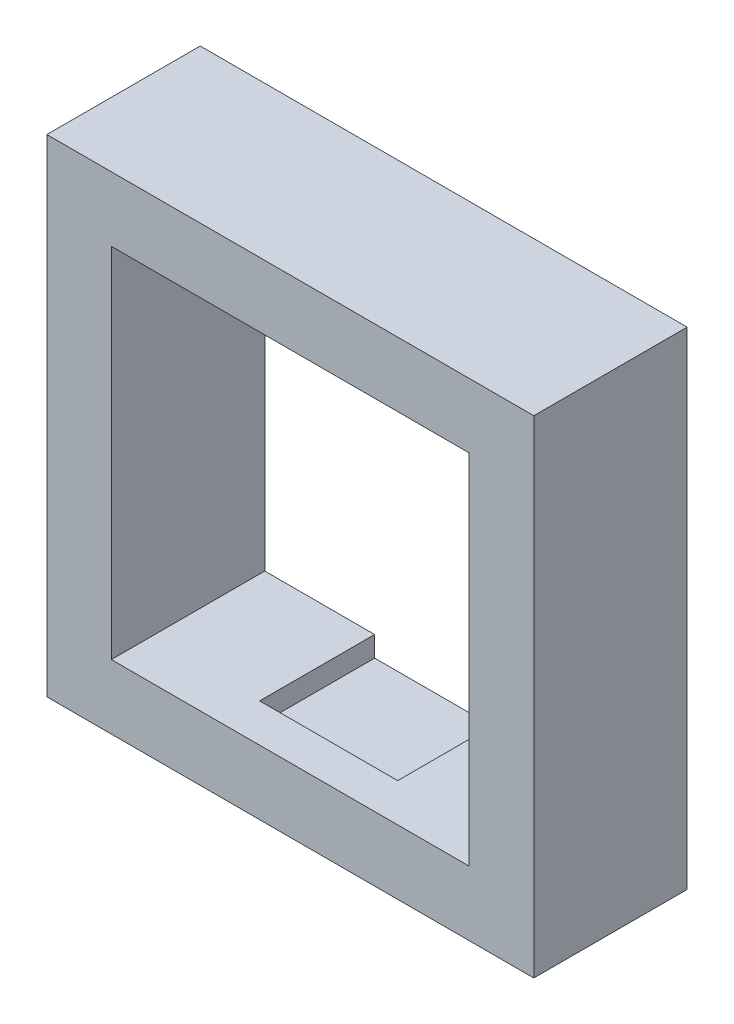
ISO-10303-21;
HEADER;
FILE_DESCRIPTION(('STEP AP214'),'2;1');
FILE_NAME('part.step','',(''),(''),'','','');
FILE_SCHEMA(('AUTOMOTIVE_DESIGN { 1 0 10303 214 1 1 1 1 }'));
ENDSEC;
DATA;
#1=APPLICATION_CONTEXT('core data for automotive mechanical design processes');
#2=APPLICATION_PROTOCOL_DEFINITION('international standard','automotive_design',2000,#1);
#3=PRODUCT_CONTEXT('',#1,'mechanical');
#4=PRODUCT('Part','Part','',(#3));
#5=PRODUCT_RELATED_PRODUCT_CATEGORY('part','',(#4));
#6=PRODUCT_DEFINITION_FORMATION('','',#4);
#7=PRODUCT_DEFINITION_CONTEXT('part definition',#1,'design');
#8=PRODUCT_DEFINITION('design','',#6,#7);
#9=PRODUCT_DEFINITION_SHAPE('','',#8);
#10=(LENGTH_UNIT() NAMED_UNIT(*) SI_UNIT(.MILLI.,.METRE.));
#11=(NAMED_UNIT(*) PLANE_ANGLE_UNIT() SI_UNIT($,.RADIAN.));
#12=(NAMED_UNIT(*) SI_UNIT($,.STERADIAN.) SOLID_ANGLE_UNIT());
#13=UNCERTAINTY_MEASURE_WITH_UNIT(LENGTH_MEASURE(1.E-05),#10,'distance_accuracy_value','');
#14=(GEOMETRIC_REPRESENTATION_CONTEXT(3) GLOBAL_UNCERTAINTY_ASSIGNED_CONTEXT((#13)) GLOBAL_UNIT_ASSIGNED_CONTEXT((#10,
#11,#12)) REPRESENTATION_CONTEXT('',''));
#15=CARTESIAN_POINT('',(0.,0.,0.));
#16=DIRECTION('',(0.,0.,1.));
#17=DIRECTION('',(1.,0.,0.));
#18=AXIS2_PLACEMENT_3D('',#15,#16,#17);
#19=CARTESIAN_POINT('',(0.,0.,0.));
#20=DIRECTION('',(0.,0.,-1.));
#21=DIRECTION('',(-1.,0.,0.));
#22=AXIS2_PLACEMENT_3D('',#19,#20,#21);
#23=PLANE('',#22);
#24=DIRECTION('',(0.,1.,0.));
#25=VECTOR('',#24,1.);
#26=CARTESIAN_POINT('',(9.525,-9.525,0.));
#27=LINE('',#26,#25);
#28=CARTESIAN_POINT('',(9.525,-9.525,0.));
#29=VERTEX_POINT('',#28);
#30=CARTESIAN_POINT('',(9.525,9.525,0.));
#31=VERTEX_POINT('',#30);
#32=EDGE_CURVE('E240',#29,#31,#27,.T.);
#33=ORIENTED_EDGE('',*,*,#32,.F.);
#34=DIRECTION('',(1.,0.,0.));
#35=VECTOR('',#34,1.);
#36=CARTESIAN_POINT('',(-9.525,-9.525,0.));
#37=LINE('',#36,#35);
#38=CARTESIAN_POINT('',(-9.525,-9.525,0.));
#39=VERTEX_POINT('',#38);
#40=EDGE_CURVE('E245',#39,#29,#37,.T.);
#41=ORIENTED_EDGE('',*,*,#40,.F.);
#42=DIRECTION('',(0.,-1.,0.));
#43=VECTOR('',#42,1.);
#44=CARTESIAN_POINT('',(-9.525,-9.525,0.));
#45=LINE('',#44,#43);
#46=CARTESIAN_POINT('',(-9.525,9.525,0.));
#47=VERTEX_POINT('',#46);
#48=EDGE_CURVE('E256',#47,#39,#45,.T.);
#49=ORIENTED_EDGE('',*,*,#48,.F.);
#50=DIRECTION('',(-1.,0.,0.));
#51=VECTOR('',#50,1.);
#52=CARTESIAN_POINT('',(-9.525,9.525,0.));
#53=LINE('',#52,#51);
#54=EDGE_CURVE('E254',#31,#47,#53,.T.);
#55=ORIENTED_EDGE('',*,*,#54,.F.);
#56=EDGE_LOOP('',(#33,#41,#49,#55));
#57=FACE_BOUND('',#56,.T.);
#58=DIRECTION('',(1.,0.,0.));
#59=VECTOR('',#58,1.);
#60=CARTESIAN_POINT('',(-7.,-7.,0.));
#61=LINE('',#60,#59);
#62=CARTESIAN_POINT('',(-7.,-7.,0.));
#63=VERTEX_POINT('',#62);
#64=CARTESIAN_POINT('',(-2.7,-7.,0.));
#65=VERTEX_POINT('',#64);
#66=EDGE_CURVE('E210',#63,#65,#61,.T.);
#67=ORIENTED_EDGE('',*,*,#66,.T.);
#68=DIRECTION('',(0.,1.,0.));
#69=VECTOR('',#68,1.);
#70=CARTESIAN_POINT('',(-2.7,-15.629224708316,0.));
#71=LINE('',#70,#69);
#72=CARTESIAN_POINT('',(-2.7,-7.8,0.));
#73=VERTEX_POINT('',#72);
#74=EDGE_CURVE('E194',#73,#65,#71,.T.);
#75=ORIENTED_EDGE('',*,*,#74,.F.);
#76=DIRECTION('',(-1.,0.,0.));
#77=VECTOR('',#76,1.);
#78=CARTESIAN_POINT('',(-2.7,-7.8,0.));
#79=LINE('',#78,#77);
#80=CARTESIAN_POINT('',(2.7,-7.8,0.));
#81=VERTEX_POINT('',#80);
#82=EDGE_CURVE('E185',#81,#73,#79,.T.);
#83=ORIENTED_EDGE('',*,*,#82,.F.);
#84=DIRECTION('',(0.,1.,0.));
#85=VECTOR('',#84,1.);
#86=CARTESIAN_POINT('',(2.7,-15.629224708316,0.));
#87=LINE('',#86,#85);
#88=CARTESIAN_POINT('',(2.7,-7.,0.));
#89=VERTEX_POINT('',#88);
#90=EDGE_CURVE('E190',#81,#89,#87,.T.);
#91=ORIENTED_EDGE('',*,*,#90,.T.);
#92=CARTESIAN_POINT('',(7.,-7.,0.));
#93=VERTEX_POINT('',#92);
#94=EDGE_CURVE('E227',#89,#93,#61,.T.);
#95=ORIENTED_EDGE('',*,*,#94,.T.);
#96=DIRECTION('',(0.,1.,0.));
#97=VECTOR('',#96,1.);
#98=CARTESIAN_POINT('',(7.,-7.,0.));
#99=LINE('',#98,#97);
#100=CARTESIAN_POINT('',(7.,7.,0.));
#101=VERTEX_POINT('',#100);
#102=EDGE_CURVE('E206',#93,#101,#99,.T.);
#103=ORIENTED_EDGE('',*,*,#102,.T.);
#104=DIRECTION('',(-1.,0.,0.));
#105=VECTOR('',#104,1.);
#106=CARTESIAN_POINT('',(-7.,7.,0.));
#107=LINE('',#106,#105);
#108=CARTESIAN_POINT('',(2.7,7.,0.));
#109=VERTEX_POINT('',#108);
#110=EDGE_CURVE('E221',#101,#109,#107,.T.);
#111=ORIENTED_EDGE('',*,*,#110,.T.);
#112=CARTESIAN_POINT('',(2.7,7.8,0.));
#113=VERTEX_POINT('',#112);
#114=EDGE_CURVE('E57',#109,#113,#87,.T.);
#115=ORIENTED_EDGE('',*,*,#114,.T.);
#116=DIRECTION('',(1.,0.,0.));
#117=VECTOR('',#116,1.);
#118=CARTESIAN_POINT('',(-2.7,7.8,0.));
#119=LINE('',#118,#117);
#120=CARTESIAN_POINT('',(-2.7,7.8,0.));
#121=VERTEX_POINT('',#120);
#122=EDGE_CURVE('E176',#121,#113,#119,.T.);
#123=ORIENTED_EDGE('',*,*,#122,.F.);
#124=CARTESIAN_POINT('',(-2.7,7.,0.));
#125=VERTEX_POINT('',#124);
#126=EDGE_CURVE('E193',#125,#121,#71,.T.);
#127=ORIENTED_EDGE('',*,*,#126,.F.);
#128=CARTESIAN_POINT('',(-7.,7.,0.));
#129=VERTEX_POINT('',#128);
#130=EDGE_CURVE('E220',#125,#129,#107,.T.);
#131=ORIENTED_EDGE('',*,*,#130,.T.);
#132=DIRECTION('',(0.,-1.,0.));
#133=VECTOR('',#132,1.);
#134=CARTESIAN_POINT('',(-7.,-7.,0.));
#135=LINE('',#134,#133);
#136=EDGE_CURVE('E224',#129,#63,#135,.T.);
#137=ORIENTED_EDGE('',*,*,#136,.T.);
#138=EDGE_LOOP('',(#67,#75,#83,#91,#95,#103,#111,#115,#123,#127,#131,#137));
#139=FACE_BOUND('',#138,.T.);
#140=ADVANCED_FACE('F42',(#57,#139),#23,.T.);
#141=CARTESIAN_POINT('',(-7.,7.,6.));
#142=DIRECTION('',(0.,-1.,0.));
#143=DIRECTION('',(0.,0.,-1.));
#144=AXIS2_PLACEMENT_3D('',#141,#142,#143);
#145=PLANE('',#144);
#146=ORIENTED_EDGE('',*,*,#130,.F.);
#147=DIRECTION('',(0.,0.,1.));
#148=VECTOR('',#147,1.);
#149=CARTESIAN_POINT('',(-2.7,7.,6.));
#150=LINE('',#149,#148);
#151=CARTESIAN_POINT('',(-2.7,7.,4.5));
#152=VERTEX_POINT('',#151);
#153=EDGE_CURVE('E203',#125,#152,#150,.T.);
#154=ORIENTED_EDGE('',*,*,#153,.T.);
#155=DIRECTION('',(1.,0.,0.));
#156=VECTOR('',#155,1.);
#157=CARTESIAN_POINT('',(-7.,7.,4.5));
#158=LINE('',#157,#156);
#159=CARTESIAN_POINT('',(2.7,7.,4.5));
#160=VERTEX_POINT('',#159);
#161=EDGE_CURVE('E201',#152,#160,#158,.T.);
#162=ORIENTED_EDGE('',*,*,#161,.T.);
#163=DIRECTION('',(0.,0.,-1.));
#164=VECTOR('',#163,1.);
#165=CARTESIAN_POINT('',(2.7,7.,6.));
#166=LINE('',#165,#164);
#167=EDGE_CURVE('E159',#160,#109,#166,.T.);
#168=ORIENTED_EDGE('',*,*,#167,.T.);
#169=ORIENTED_EDGE('',*,*,#110,.F.);
#170=DIRECTION('',(0.,0.,-1.));
#171=VECTOR('',#170,1.);
#172=CARTESIAN_POINT('',(7.,7.,6.));
#173=LINE('',#172,#171);
#174=CARTESIAN_POINT('',(7.,7.,6.));
#175=VERTEX_POINT('',#174);
#176=EDGE_CURVE('E237',#175,#101,#173,.T.);
#177=ORIENTED_EDGE('',*,*,#176,.F.);
#178=DIRECTION('',(-1.,0.,0.));
#179=VECTOR('',#178,1.);
#180=CARTESIAN_POINT('',(-7.,7.,6.));
#181=LINE('',#180,#179);
#182=CARTESIAN_POINT('',(-7.,7.,6.));
#183=VERTEX_POINT('',#182);
#184=EDGE_CURVE('E209',#175,#183,#181,.T.);
#185=ORIENTED_EDGE('',*,*,#184,.T.);
#186=DIRECTION('',(0.,0.,-1.));
#187=VECTOR('',#186,1.);
#188=CARTESIAN_POINT('',(-7.,7.,6.));
#189=LINE('',#188,#187);
#190=EDGE_CURVE('E234',#183,#129,#189,.T.);
#191=ORIENTED_EDGE('',*,*,#190,.T.);
#192=EDGE_LOOP('',(#146,#154,#162,#168,#169,#177,#185,#191));
#193=FACE_BOUND('',#192,.T.);
#194=ADVANCED_FACE('F305',(#193),#145,.T.);
#195=CARTESIAN_POINT('',(-7.,-7.,6.));
#196=DIRECTION('',(0.,1.,0.));
#197=DIRECTION('',(0.,0.,1.));
#198=AXIS2_PLACEMENT_3D('',#195,#196,#197);
#199=PLANE('',#198);
#200=DIRECTION('',(-1.,0.,0.));
#201=VECTOR('',#200,1.);
#202=CARTESIAN_POINT('',(-7.,-7.,4.5));
#203=LINE('',#202,#201);
#204=CARTESIAN_POINT('',(2.7,-7.,4.5));
#205=VERTEX_POINT('',#204);
#206=CARTESIAN_POINT('',(-2.7,-7.,4.5));
#207=VERTEX_POINT('',#206);
#208=EDGE_CURVE('E50',#205,#207,#203,.T.);
#209=ORIENTED_EDGE('',*,*,#208,.T.);
#210=DIRECTION('',(0.,0.,-1.));
#211=VECTOR('',#210,1.);
#212=CARTESIAN_POINT('',(-2.7,-7.,6.));
#213=LINE('',#212,#211);
#214=EDGE_CURVE('E13',#207,#65,#213,.T.);
#215=ORIENTED_EDGE('',*,*,#214,.T.);
#216=ORIENTED_EDGE('',*,*,#66,.F.);
#217=DIRECTION('',(0.,0.,-1.));
#218=VECTOR('',#217,1.);
#219=CARTESIAN_POINT('',(-7.,-7.,6.));
#220=LINE('',#219,#218);
#221=CARTESIAN_POINT('',(-7.,-7.,6.));
#222=VERTEX_POINT('',#221);
#223=EDGE_CURVE('E232',#222,#63,#220,.T.);
#224=ORIENTED_EDGE('',*,*,#223,.F.);
#225=DIRECTION('',(1.,0.,0.));
#226=VECTOR('',#225,1.);
#227=CARTESIAN_POINT('',(-7.,-7.,6.));
#228=LINE('',#227,#226);
#229=CARTESIAN_POINT('',(7.,-7.,6.));
#230=VERTEX_POINT('',#229);
#231=EDGE_CURVE('E215',#222,#230,#228,.T.);
#232=ORIENTED_EDGE('',*,*,#231,.T.);
#233=DIRECTION('',(0.,0.,-1.));
#234=VECTOR('',#233,1.);
#235=CARTESIAN_POINT('',(7.,-7.,6.));
#236=LINE('',#235,#234);
#237=EDGE_CURVE('E217',#230,#93,#236,.T.);
#238=ORIENTED_EDGE('',*,*,#237,.T.);
#239=ORIENTED_EDGE('',*,*,#94,.F.);
#240=DIRECTION('',(0.,0.,1.));
#241=VECTOR('',#240,1.);
#242=CARTESIAN_POINT('',(2.7,-7.,6.));
#243=LINE('',#242,#241);
#244=EDGE_CURVE('E270',#89,#205,#243,.T.);
#245=ORIENTED_EDGE('',*,*,#244,.T.);
#246=EDGE_LOOP('',(#209,#215,#216,#224,#232,#238,#239,#245));
#247=FACE_BOUND('',#246,.T.);
#248=ADVANCED_FACE('F274',(#247),#199,.T.);
#249=CARTESIAN_POINT('',(0.,0.,6.));
#250=DIRECTION('',(0.,0.,-1.));
#251=DIRECTION('',(-1.,0.,0.));
#252=AXIS2_PLACEMENT_3D('',#249,#250,#251);
#253=PLANE('',#252);
#254=DIRECTION('',(0.,1.,0.));
#255=VECTOR('',#254,1.);
#256=CARTESIAN_POINT('',(9.525,-9.525,6.));
#257=LINE('',#256,#255);
#258=CARTESIAN_POINT('',(9.525,-9.525,6.));
#259=VERTEX_POINT('',#258);
#260=CARTESIAN_POINT('',(9.525,9.525,6.));
#261=VERTEX_POINT('',#260);
#262=EDGE_CURVE('E241',#259,#261,#257,.T.);
#263=ORIENTED_EDGE('',*,*,#262,.T.);
#264=DIRECTION('',(-1.,0.,0.));
#265=VECTOR('',#264,1.);
#266=CARTESIAN_POINT('',(-9.525,9.525,6.));
#267=LINE('',#266,#265);
#268=CARTESIAN_POINT('',(-9.525,9.525,6.));
#269=VERTEX_POINT('',#268);
#270=EDGE_CURVE('E244',#261,#269,#267,.T.);
#271=ORIENTED_EDGE('',*,*,#270,.T.);
#272=DIRECTION('',(0.,-1.,0.));
#273=VECTOR('',#272,1.);
#274=CARTESIAN_POINT('',(-9.525,-9.525,6.));
#275=LINE('',#274,#273);
#276=CARTESIAN_POINT('',(-9.525,-9.525,6.));
#277=VERTEX_POINT('',#276);
#278=EDGE_CURVE('E247',#269,#277,#275,.T.);
#279=ORIENTED_EDGE('',*,*,#278,.T.);
#280=DIRECTION('',(1.,0.,0.));
#281=VECTOR('',#280,1.);
#282=CARTESIAN_POINT('',(-9.525,-9.525,6.));
#283=LINE('',#282,#281);
#284=EDGE_CURVE('E249',#277,#259,#283,.T.);
#285=ORIENTED_EDGE('',*,*,#284,.T.);
#286=EDGE_LOOP('',(#263,#271,#279,#285));
#287=FACE_BOUND('',#286,.T.);
#288=DIRECTION('',(0.,1.,0.));
#289=VECTOR('',#288,1.);
#290=CARTESIAN_POINT('',(7.,-7.,6.));
#291=LINE('',#290,#289);
#292=EDGE_CURVE('E207',#230,#175,#291,.T.);
#293=ORIENTED_EDGE('',*,*,#292,.F.);
#294=ORIENTED_EDGE('',*,*,#231,.F.);
#295=DIRECTION('',(0.,-1.,0.));
#296=VECTOR('',#295,1.);
#297=CARTESIAN_POINT('',(-7.,-7.,6.));
#298=LINE('',#297,#296);
#299=EDGE_CURVE('E212',#183,#222,#298,.T.);
#300=ORIENTED_EDGE('',*,*,#299,.F.);
#301=ORIENTED_EDGE('',*,*,#184,.F.);
#302=EDGE_LOOP('',(#293,#294,#300,#301));
#303=FACE_BOUND('',#302,.T.);
#304=ADVANCED_FACE('F298',(#287,#303),#253,.F.);
#305=CARTESIAN_POINT('',(9.525,-9.525,6.));
#306=DIRECTION('',(-1.,0.,0.));
#307=DIRECTION('',(0.,0.,1.));
#308=AXIS2_PLACEMENT_3D('',#305,#306,#307);
#309=PLANE('',#308);
#310=ORIENTED_EDGE('',*,*,#32,.T.);
#311=DIRECTION('',(0.,0.,-1.));
#312=VECTOR('',#311,1.);
#313=CARTESIAN_POINT('',(9.525,9.525,6.));
#314=LINE('',#313,#312);
#315=EDGE_CURVE('E267',#261,#31,#314,.T.);
#316=ORIENTED_EDGE('',*,*,#315,.F.);
#317=ORIENTED_EDGE('',*,*,#262,.F.);
#318=DIRECTION('',(0.,0.,-1.));
#319=VECTOR('',#318,1.);
#320=CARTESIAN_POINT('',(9.525,-9.525,6.));
#321=LINE('',#320,#319);
#322=EDGE_CURVE('E251',#259,#29,#321,.T.);
#323=ORIENTED_EDGE('',*,*,#322,.T.);
#324=EDGE_LOOP('',(#310,#316,#317,#323));
#325=FACE_BOUND('',#324,.T.);
#326=ADVANCED_FACE('F44',(#325),#309,.F.);
#327=CARTESIAN_POINT('',(-9.525,9.525,6.));
#328=DIRECTION('',(0.,-1.,0.));
#329=DIRECTION('',(0.,0.,-1.));
#330=AXIS2_PLACEMENT_3D('',#327,#328,#329);
#331=PLANE('',#330);
#332=ORIENTED_EDGE('',*,*,#54,.T.);
#333=DIRECTION('',(0.,0.,-1.));
#334=VECTOR('',#333,1.);
#335=CARTESIAN_POINT('',(-9.525,9.525,6.));
#336=LINE('',#335,#334);
#337=EDGE_CURVE('E264',#269,#47,#336,.T.);
#338=ORIENTED_EDGE('',*,*,#337,.F.);
#339=ORIENTED_EDGE('',*,*,#270,.F.);
#340=ORIENTED_EDGE('',*,*,#315,.T.);
#341=EDGE_LOOP('',(#332,#338,#339,#340));
#342=FACE_BOUND('',#341,.T.);
#343=ADVANCED_FACE('F335',(#342),#331,.F.);
#344=CARTESIAN_POINT('',(-9.525,-9.525,6.));
#345=DIRECTION('',(1.,0.,0.));
#346=DIRECTION('',(0.,0.,-1.));
#347=AXIS2_PLACEMENT_3D('',#344,#345,#346);
#348=PLANE('',#347);
#349=ORIENTED_EDGE('',*,*,#48,.T.);
#350=DIRECTION('',(0.,0.,-1.));
#351=VECTOR('',#350,1.);
#352=CARTESIAN_POINT('',(-9.525,-9.525,6.));
#353=LINE('',#352,#351);
#354=EDGE_CURVE('E261',#277,#39,#353,.T.);
#355=ORIENTED_EDGE('',*,*,#354,.F.);
#356=ORIENTED_EDGE('',*,*,#278,.F.);
#357=ORIENTED_EDGE('',*,*,#337,.T.);
#358=EDGE_LOOP('',(#349,#355,#356,#357));
#359=FACE_BOUND('',#358,.T.);
#360=ADVANCED_FACE('F332',(#359),#348,.F.);
#361=CARTESIAN_POINT('',(-9.525,-9.525,6.));
#362=DIRECTION('',(0.,1.,0.));
#363=DIRECTION('',(0.,0.,1.));
#364=AXIS2_PLACEMENT_3D('',#361,#362,#363);
#365=PLANE('',#364);
#366=ORIENTED_EDGE('',*,*,#40,.T.);
#367=ORIENTED_EDGE('',*,*,#322,.F.);
#368=ORIENTED_EDGE('',*,*,#284,.F.);
#369=ORIENTED_EDGE('',*,*,#354,.T.);
#370=EDGE_LOOP('',(#366,#367,#368,#369));
#371=FACE_BOUND('',#370,.T.);
#372=ADVANCED_FACE('F329',(#371),#365,.F.);
#373=CARTESIAN_POINT('',(7.,-7.,6.));
#374=DIRECTION('',(-1.,0.,0.));
#375=DIRECTION('',(0.,0.,1.));
#376=AXIS2_PLACEMENT_3D('',#373,#374,#375);
#377=PLANE('',#376);
#378=ORIENTED_EDGE('',*,*,#102,.F.);
#379=ORIENTED_EDGE('',*,*,#237,.F.);
#380=ORIENTED_EDGE('',*,*,#292,.T.);
#381=ORIENTED_EDGE('',*,*,#176,.T.);
#382=EDGE_LOOP('',(#378,#379,#380,#381));
#383=FACE_BOUND('',#382,.T.);
#384=ADVANCED_FACE('F302',(#383),#377,.T.);
#385=CARTESIAN_POINT('',(-7.,-7.,6.));
#386=DIRECTION('',(1.,0.,0.));
#387=DIRECTION('',(0.,0.,-1.));
#388=AXIS2_PLACEMENT_3D('',#385,#386,#387);
#389=PLANE('',#388);
#390=ORIENTED_EDGE('',*,*,#136,.F.);
#391=ORIENTED_EDGE('',*,*,#190,.F.);
#392=ORIENTED_EDGE('',*,*,#299,.T.);
#393=ORIENTED_EDGE('',*,*,#223,.T.);
#394=EDGE_LOOP('',(#390,#391,#392,#393));
#395=FACE_BOUND('',#394,.T.);
#396=ADVANCED_FACE('F294',(#395),#389,.T.);
#397=CARTESIAN_POINT('',(2.7,-15.629224708316,0.));
#398=DIRECTION('',(-1.,0.,0.));
#399=DIRECTION('',(0.,0.,1.));
#400=AXIS2_PLACEMENT_3D('',#397,#398,#399);
#401=PLANE('',#400);
#402=ORIENTED_EDGE('',*,*,#90,.F.);
#403=DIRECTION('',(0.,0.,-1.));
#404=VECTOR('',#403,1.);
#405=CARTESIAN_POINT('',(2.7,-7.8,0.));
#406=LINE('',#405,#404);
#407=CARTESIAN_POINT('',(2.7,-7.8,4.5));
#408=VERTEX_POINT('',#407);
#409=EDGE_CURVE('E188',#408,#81,#406,.T.);
#410=ORIENTED_EDGE('',*,*,#409,.F.);
#411=DIRECTION('',(0.,1.,0.));
#412=VECTOR('',#411,1.);
#413=CARTESIAN_POINT('',(2.7,-15.629224708316,4.5));
#414=LINE('',#413,#412);
#415=EDGE_CURVE('E65',#408,#205,#414,.T.);
#416=ORIENTED_EDGE('',*,*,#415,.T.);
#417=ORIENTED_EDGE('',*,*,#244,.F.);
#418=EDGE_LOOP('',(#402,#410,#416,#417));
#419=FACE_BOUND('',#418,.T.);
#420=ADVANCED_FACE('F306',(#419),#401,.T.);
#421=CARTESIAN_POINT('',(-2.7,-15.629224708316,4.5));
#422=DIRECTION('',(0.,0.,-1.));
#423=DIRECTION('',(-1.,0.,0.));
#424=AXIS2_PLACEMENT_3D('',#421,#422,#423);
#425=PLANE('',#424);
#426=ORIENTED_EDGE('',*,*,#415,.F.);
#427=DIRECTION('',(1.,0.,0.));
#428=VECTOR('',#427,1.);
#429=CARTESIAN_POINT('',(-2.7,-7.8,4.5));
#430=LINE('',#429,#428);
#431=CARTESIAN_POINT('',(-2.7,-7.8,4.5));
#432=VERTEX_POINT('',#431);
#433=EDGE_CURVE('E184',#432,#408,#430,.T.);
#434=ORIENTED_EDGE('',*,*,#433,.F.);
#435=DIRECTION('',(0.,1.,0.));
#436=VECTOR('',#435,1.);
#437=CARTESIAN_POINT('',(-2.7,-15.629224708316,4.5));
#438=LINE('',#437,#436);
#439=EDGE_CURVE('E162',#432,#207,#438,.T.);
#440=ORIENTED_EDGE('',*,*,#439,.T.);
#441=ORIENTED_EDGE('',*,*,#208,.F.);
#442=EDGE_LOOP('',(#426,#434,#440,#441));
#443=FACE_BOUND('',#442,.T.);
#444=ADVANCED_FACE('F278',(#443),#425,.T.);
#445=CARTESIAN_POINT('',(-2.7,-15.629224708316,0.));
#446=DIRECTION('',(1.,0.,0.));
#447=DIRECTION('',(0.,0.,-1.));
#448=AXIS2_PLACEMENT_3D('',#445,#446,#447);
#449=PLANE('',#448);
#450=ORIENTED_EDGE('',*,*,#439,.F.);
#451=DIRECTION('',(0.,0.,1.));
#452=VECTOR('',#451,1.);
#453=CARTESIAN_POINT('',(-2.7,-7.8,0.));
#454=LINE('',#453,#452);
#455=EDGE_CURVE('E181',#73,#432,#454,.T.);
#456=ORIENTED_EDGE('',*,*,#455,.F.);
#457=ORIENTED_EDGE('',*,*,#74,.T.);
#458=ORIENTED_EDGE('',*,*,#214,.F.);
#459=EDGE_LOOP('',(#450,#456,#457,#458));
#460=FACE_BOUND('',#459,.T.);
#461=ADVANCED_FACE('F281',(#460),#449,.T.);
#462=CARTESIAN_POINT('',(-7.,-7.8,6.));
#463=DIRECTION('',(0.,1.,0.));
#464=DIRECTION('',(0.,0.,1.));
#465=AXIS2_PLACEMENT_3D('',#462,#463,#464);
#466=PLANE('',#465);
#467=ORIENTED_EDGE('',*,*,#433,.T.);
#468=ORIENTED_EDGE('',*,*,#409,.T.);
#469=ORIENTED_EDGE('',*,*,#82,.T.);
#470=ORIENTED_EDGE('',*,*,#455,.T.);
#471=EDGE_LOOP('',(#467,#468,#469,#470));
#472=FACE_BOUND('',#471,.T.);
#473=ADVANCED_FACE('F283',(#472),#466,.T.);
#474=ORIENTED_EDGE('',*,*,#126,.T.);
#475=DIRECTION('',(0.,0.,-1.));
#476=VECTOR('',#475,1.);
#477=CARTESIAN_POINT('',(-2.7,7.8,0.));
#478=LINE('',#477,#476);
#479=CARTESIAN_POINT('',(-2.7,7.8,4.5));
#480=VERTEX_POINT('',#479);
#481=EDGE_CURVE('E172',#480,#121,#478,.T.);
#482=ORIENTED_EDGE('',*,*,#481,.F.);
#483=EDGE_CURVE('E168',#152,#480,#438,.T.);
#484=ORIENTED_EDGE('',*,*,#483,.F.);
#485=ORIENTED_EDGE('',*,*,#153,.F.);
#486=EDGE_LOOP('',(#474,#482,#484,#485));
#487=FACE_BOUND('',#486,.T.);
#488=ADVANCED_FACE('F402',(#487),#449,.T.);
#489=ORIENTED_EDGE('',*,*,#483,.T.);
#490=DIRECTION('',(-1.,0.,0.));
#491=VECTOR('',#490,1.);
#492=CARTESIAN_POINT('',(-2.7,7.8,4.5));
#493=LINE('',#492,#491);
#494=CARTESIAN_POINT('',(2.7,7.8,4.5));
#495=VERTEX_POINT('',#494);
#496=EDGE_CURVE('E165',#495,#480,#493,.T.);
#497=ORIENTED_EDGE('',*,*,#496,.F.);
#498=EDGE_CURVE('E153',#160,#495,#414,.T.);
#499=ORIENTED_EDGE('',*,*,#498,.F.);
#500=ORIENTED_EDGE('',*,*,#161,.F.);
#501=EDGE_LOOP('',(#489,#497,#499,#500));
#502=FACE_BOUND('',#501,.T.);
#503=ADVANCED_FACE('F166',(#502),#425,.T.);
#504=ORIENTED_EDGE('',*,*,#498,.T.);
#505=DIRECTION('',(0.,0.,1.));
#506=VECTOR('',#505,1.);
#507=CARTESIAN_POINT('',(2.7,7.8,0.));
#508=LINE('',#507,#506);
#509=EDGE_CURVE('E157',#113,#495,#508,.T.);
#510=ORIENTED_EDGE('',*,*,#509,.F.);
#511=ORIENTED_EDGE('',*,*,#114,.F.);
#512=ORIENTED_EDGE('',*,*,#167,.F.);
#513=EDGE_LOOP('',(#504,#510,#511,#512));
#514=FACE_BOUND('',#513,.T.);
#515=ADVANCED_FACE('F155',(#514),#401,.T.);
#516=CARTESIAN_POINT('',(0.,7.8,0.));
#517=DIRECTION('',(0.,1.,0.));
#518=DIRECTION('',(0.,0.,1.));
#519=AXIS2_PLACEMENT_3D('',#516,#517,#518);
#520=PLANE('',#519);
#521=ORIENTED_EDGE('',*,*,#509,.T.);
#522=ORIENTED_EDGE('',*,*,#496,.T.);
#523=ORIENTED_EDGE('',*,*,#481,.T.);
#524=ORIENTED_EDGE('',*,*,#122,.T.);
#525=EDGE_LOOP('',(#521,#522,#523,#524));
#526=FACE_BOUND('',#525,.T.);
#527=ADVANCED_FACE('F174',(#526),#520,.F.);
#528=CLOSED_SHELL('',(#140,#194,#248,#304,#326,#343,#360,#372,#384,#396,#420,#444,#461,#473,
#488,#503,#515,#527));
#529=MANIFOLD_SOLID_BREP('B2',#528);
#530=ADVANCED_BREP_SHAPE_REPRESENTATION('',(#18,#529),#14);
#531=SHAPE_DEFINITION_REPRESENTATION(#9,#530);
ENDSEC;
END-ISO-10303-21;
